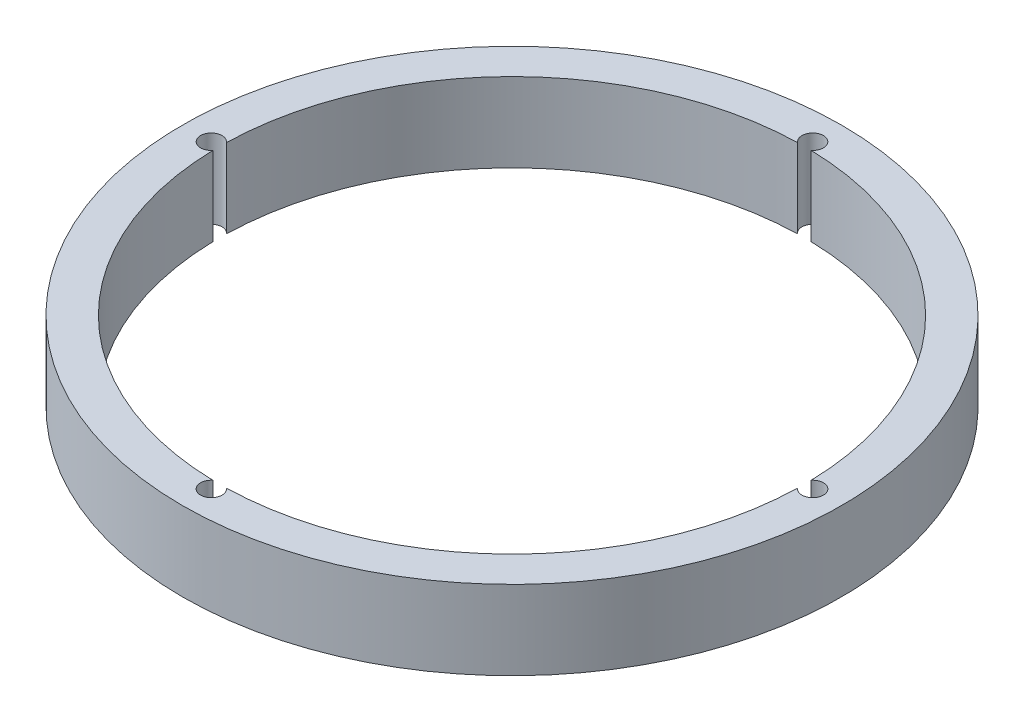
ISO-10303-21;
HEADER;
FILE_DESCRIPTION(('STEP AP214'),'2;1');
FILE_NAME('part.step','',(''),(''),'','','');
FILE_SCHEMA(('AUTOMOTIVE_DESIGN { 1 0 10303 214 1 1 1 1 }'));
ENDSEC;
DATA;
#1=APPLICATION_CONTEXT('core data for automotive mechanical design processes');
#2=APPLICATION_PROTOCOL_DEFINITION('international standard','automotive_design',2000,#1);
#3=PRODUCT_CONTEXT('',#1,'mechanical');
#4=PRODUCT('Part','Part','',(#3));
#5=PRODUCT_RELATED_PRODUCT_CATEGORY('part','',(#4));
#6=PRODUCT_DEFINITION_FORMATION('','',#4);
#7=PRODUCT_DEFINITION_CONTEXT('part definition',#1,'design');
#8=PRODUCT_DEFINITION('design','',#6,#7);
#9=PRODUCT_DEFINITION_SHAPE('','',#8);
#10=(LENGTH_UNIT() NAMED_UNIT(*) SI_UNIT(.MILLI.,.METRE.));
#11=(NAMED_UNIT(*) PLANE_ANGLE_UNIT() SI_UNIT($,.RADIAN.));
#12=(NAMED_UNIT(*) SI_UNIT($,.STERADIAN.) SOLID_ANGLE_UNIT());
#13=UNCERTAINTY_MEASURE_WITH_UNIT(LENGTH_MEASURE(1.E-05),#10,'distance_accuracy_value','');
#14=(GEOMETRIC_REPRESENTATION_CONTEXT(3) GLOBAL_UNCERTAINTY_ASSIGNED_CONTEXT((#13)) GLOBAL_UNIT_ASSIGNED_CONTEXT((#10,
#11,#12)) REPRESENTATION_CONTEXT('',''));
#15=CARTESIAN_POINT('',(0.,0.,0.));
#16=DIRECTION('',(0.,0.,1.));
#17=DIRECTION('',(1.,0.,0.));
#18=AXIS2_PLACEMENT_3D('',#15,#16,#17);
#19=CARTESIAN_POINT('',(0.,19.2,0.));
#20=DIRECTION('',(0.,1.,0.));
#21=DIRECTION('',(0.,0.,1.));
#22=AXIS2_PLACEMENT_3D('',#19,#20,#21);
#23=PLANE('',#22);
#24=CARTESIAN_POINT('',(0.,19.2,0.));
#25=DIRECTION('',(0.,1.,0.));
#26=DIRECTION('',(0.,0.,1.));
#27=AXIS2_PLACEMENT_3D('',#24,#25,#26);
#28=CIRCLE('',#27,80.);
#29=CARTESIAN_POINT('',(0.,19.2,80.));
#30=VERTEX_POINT('',#29);
#31=EDGE_CURVE('E11',#30,#30,#28,.T.);
#32=ORIENTED_EDGE('',*,*,#31,.T.);
#33=EDGE_LOOP('',(#32));
#34=FACE_BOUND('',#33,.T.);
#35=CARTESIAN_POINT('',(0.,19.2,-73.));
#36=DIRECTION('',(0.,1.,0.));
#37=DIRECTION('',(0.,0.,1.));
#38=AXIS2_PLACEMENT_3D('',#35,#36,#37);
#39=CIRCLE('',#38,2.60000000000025);
#40=CARTESIAN_POINT('',(1.63829978828229,19.2,-70.981095890411));
#41=VERTEX_POINT('',#40);
#42=CARTESIAN_POINT('',(-1.63829978828228,19.2,-70.981095890411));
#43=VERTEX_POINT('',#42);
#44=EDGE_CURVE('E118',#41,#43,#39,.T.);
#45=ORIENTED_EDGE('',*,*,#44,.F.);
#46=CARTESIAN_POINT('',(0.,19.2,0.));
#47=DIRECTION('',(0.,1.,0.));
#48=DIRECTION('',(0.,0.,1.));
#49=AXIS2_PLACEMENT_3D('',#46,#47,#48);
#50=CIRCLE('',#49,71.);
#51=CARTESIAN_POINT('',(70.981095890411,19.2,-1.638299788282));
#52=VERTEX_POINT('',#51);
#53=EDGE_CURVE('E109',#52,#41,#50,.T.);
#54=ORIENTED_EDGE('',*,*,#53,.F.);
#55=CARTESIAN_POINT('',(73.,19.2,2.54878137735549E-13));
#56=DIRECTION('',(0.,1.,0.));
#57=DIRECTION('',(0.,0.,1.));
#58=AXIS2_PLACEMENT_3D('',#55,#56,#57);
#59=CIRCLE('',#58,2.6000000000002);
#60=CARTESIAN_POINT('',(70.9810958904109,19.2,1.63829978828238));
#61=VERTEX_POINT('',#60);
#62=EDGE_CURVE('E149',#61,#52,#59,.T.);
#63=ORIENTED_EDGE('',*,*,#62,.F.);
#64=CARTESIAN_POINT('',(0.,19.2,0.));
#65=DIRECTION('',(0.,1.,0.));
#66=DIRECTION('',(0.,0.,1.));
#67=AXIS2_PLACEMENT_3D('',#64,#65,#66);
#68=CIRCLE('',#67,71.);
#69=CARTESIAN_POINT('',(1.6382997882816,19.2,70.981095890411));
#70=VERTEX_POINT('',#69);
#71=EDGE_CURVE('E146',#70,#61,#68,.T.);
#72=ORIENTED_EDGE('',*,*,#71,.F.);
#73=CARTESIAN_POINT('',(-5.09756275471097E-13,19.2,73.));
#74=DIRECTION('',(0.,1.,0.));
#75=DIRECTION('',(0.,0.,1.));
#76=AXIS2_PLACEMENT_3D('',#73,#74,#75);
#77=CIRCLE('',#76,2.60000000000019);
#78=CARTESIAN_POINT('',(-1.63829978828274,19.2,70.981095890411));
#79=VERTEX_POINT('',#78);
#80=EDGE_CURVE('E143',#79,#70,#77,.T.);
#81=ORIENTED_EDGE('',*,*,#80,.F.);
#82=CARTESIAN_POINT('',(0.,19.2,0.));
#83=DIRECTION('',(0.,1.,0.));
#84=DIRECTION('',(0.,0.,1.));
#85=AXIS2_PLACEMENT_3D('',#82,#83,#84);
#86=CIRCLE('',#85,71.);
#87=CARTESIAN_POINT('',(-70.981095890411,19.2,1.63829978828155));
#88=VERTEX_POINT('',#87);
#89=EDGE_CURVE('E140',#88,#79,#86,.T.);
#90=ORIENTED_EDGE('',*,*,#89,.F.);
#91=CARTESIAN_POINT('',(-73.,19.2,-7.64634413206646E-13));
#92=DIRECTION('',(0.,1.,0.));
#93=DIRECTION('',(0.,0.,1.));
#94=AXIS2_PLACEMENT_3D('',#91,#92,#93);
#95=CIRCLE('',#94,2.60000000000025);
#96=CARTESIAN_POINT('',(-70.9810958904109,19.2,-1.63829978828303));
#97=VERTEX_POINT('',#96);
#98=EDGE_CURVE('E135',#97,#88,#95,.T.);
#99=ORIENTED_EDGE('',*,*,#98,.F.);
#100=CARTESIAN_POINT('',(0.,19.2,0.));
#101=DIRECTION('',(0.,1.,0.));
#102=DIRECTION('',(0.,0.,1.));
#103=AXIS2_PLACEMENT_3D('',#100,#101,#102);
#104=CIRCLE('',#103,71.);
#105=EDGE_CURVE('E131',#43,#97,#104,.T.);
#106=ORIENTED_EDGE('',*,*,#105,.F.);
#107=EDGE_LOOP('',(#45,#54,#63,#72,#81,#90,#99,#106));
#108=FACE_BOUND('',#107,.T.);
#109=ADVANCED_FACE('F43',(#34,#108),#23,.T.);
#110=CARTESIAN_POINT('',(0.,0.,0.));
#111=DIRECTION('',(0.,1.,0.));
#112=DIRECTION('',(0.,0.,1.));
#113=AXIS2_PLACEMENT_3D('',#110,#111,#112);
#114=PLANE('',#113);
#115=CARTESIAN_POINT('',(0.,0.,0.));
#116=DIRECTION('',(0.,1.,0.));
#117=DIRECTION('',(0.,0.,1.));
#118=AXIS2_PLACEMENT_3D('',#115,#116,#117);
#119=CIRCLE('',#118,80.);
#120=CARTESIAN_POINT('',(0.,0.,80.));
#121=VERTEX_POINT('',#120);
#122=EDGE_CURVE('E47',#121,#121,#119,.T.);
#123=ORIENTED_EDGE('',*,*,#122,.F.);
#124=EDGE_LOOP('',(#123));
#125=FACE_BOUND('',#124,.T.);
#126=CARTESIAN_POINT('',(0.,0.,0.));
#127=DIRECTION('',(0.,1.,0.));
#128=DIRECTION('',(0.,0.,1.));
#129=AXIS2_PLACEMENT_3D('',#126,#127,#128);
#130=CIRCLE('',#129,71.);
#131=CARTESIAN_POINT('',(70.981095890411,0.,-1.638299788282));
#132=VERTEX_POINT('',#131);
#133=CARTESIAN_POINT('',(1.63829978828229,0.,-70.981095890411));
#134=VERTEX_POINT('',#133);
#135=EDGE_CURVE('E67',#132,#134,#130,.T.);
#136=ORIENTED_EDGE('',*,*,#135,.T.);
#137=CARTESIAN_POINT('',(0.,0.,-73.));
#138=DIRECTION('',(0.,1.,0.));
#139=DIRECTION('',(0.,0.,1.));
#140=AXIS2_PLACEMENT_3D('',#137,#138,#139);
#141=CIRCLE('',#140,2.60000000000025);
#142=CARTESIAN_POINT('',(-1.63829978828228,0.,-70.981095890411));
#143=VERTEX_POINT('',#142);
#144=EDGE_CURVE('E125',#134,#143,#141,.T.);
#145=ORIENTED_EDGE('',*,*,#144,.T.);
#146=CARTESIAN_POINT('',(0.,0.,0.));
#147=DIRECTION('',(0.,1.,0.));
#148=DIRECTION('',(0.,0.,1.));
#149=AXIS2_PLACEMENT_3D('',#146,#147,#148);
#150=CIRCLE('',#149,71.);
#151=CARTESIAN_POINT('',(-70.9810958904109,0.,-1.63829978828303));
#152=VERTEX_POINT('',#151);
#153=EDGE_CURVE('E156',#143,#152,#150,.T.);
#154=ORIENTED_EDGE('',*,*,#153,.T.);
#155=CARTESIAN_POINT('',(-73.,0.,-7.64634413206646E-13));
#156=DIRECTION('',(0.,1.,0.));
#157=DIRECTION('',(0.,0.,1.));
#158=AXIS2_PLACEMENT_3D('',#155,#156,#157);
#159=CIRCLE('',#158,2.60000000000025);
#160=CARTESIAN_POINT('',(-70.981095890411,0.,1.63829978828155));
#161=VERTEX_POINT('',#160);
#162=EDGE_CURVE('E160',#152,#161,#159,.T.);
#163=ORIENTED_EDGE('',*,*,#162,.T.);
#164=CARTESIAN_POINT('',(0.,0.,0.));
#165=DIRECTION('',(0.,1.,0.));
#166=DIRECTION('',(0.,0.,1.));
#167=AXIS2_PLACEMENT_3D('',#164,#165,#166);
#168=CIRCLE('',#167,71.);
#169=CARTESIAN_POINT('',(-1.63829978828274,0.,70.981095890411));
#170=VERTEX_POINT('',#169);
#171=EDGE_CURVE('E164',#161,#170,#168,.T.);
#172=ORIENTED_EDGE('',*,*,#171,.T.);
#173=CARTESIAN_POINT('',(-5.09756275471097E-13,0.,73.));
#174=DIRECTION('',(0.,1.,0.));
#175=DIRECTION('',(0.,0.,1.));
#176=AXIS2_PLACEMENT_3D('',#173,#174,#175);
#177=CIRCLE('',#176,2.60000000000019);
#178=CARTESIAN_POINT('',(1.6382997882816,0.,70.981095890411));
#179=VERTEX_POINT('',#178);
#180=EDGE_CURVE('E168',#170,#179,#177,.T.);
#181=ORIENTED_EDGE('',*,*,#180,.T.);
#182=CARTESIAN_POINT('',(0.,0.,0.));
#183=DIRECTION('',(0.,1.,0.));
#184=DIRECTION('',(0.,0.,1.));
#185=AXIS2_PLACEMENT_3D('',#182,#183,#184);
#186=CIRCLE('',#185,71.);
#187=CARTESIAN_POINT('',(70.9810958904109,0.,1.63829978828238));
#188=VERTEX_POINT('',#187);
#189=EDGE_CURVE('E172',#179,#188,#186,.T.);
#190=ORIENTED_EDGE('',*,*,#189,.T.);
#191=CARTESIAN_POINT('',(73.,0.,2.54878137735549E-13));
#192=DIRECTION('',(0.,1.,0.));
#193=DIRECTION('',(0.,0.,1.));
#194=AXIS2_PLACEMENT_3D('',#191,#192,#193);
#195=CIRCLE('',#194,2.6000000000002);
#196=EDGE_CURVE('E119',#188,#132,#195,.T.);
#197=ORIENTED_EDGE('',*,*,#196,.T.);
#198=EDGE_LOOP('',(#136,#145,#154,#163,#172,#181,#190,#197));
#199=FACE_BOUND('',#198,.T.);
#200=ADVANCED_FACE('F202',(#125,#199),#114,.F.);
#201=CARTESIAN_POINT('',(0.,19.2,0.));
#202=DIRECTION('',(0.,-1.,0.));
#203=DIRECTION('',(0.,0.,-1.));
#204=AXIS2_PLACEMENT_3D('',#201,#202,#203);
#205=CYLINDRICAL_SURFACE('',#204,80.);
#206=ORIENTED_EDGE('',*,*,#31,.F.);
#207=EDGE_LOOP('',(#206));
#208=FACE_BOUND('',#207,.T.);
#209=ORIENTED_EDGE('',*,*,#122,.T.);
#210=EDGE_LOOP('',(#209));
#211=FACE_BOUND('',#210,.T.);
#212=ADVANCED_FACE('F45',(#208,#211),#205,.T.);
#213=CARTESIAN_POINT('',(0.,19.2,0.));
#214=DIRECTION('',(0.,-1.,0.));
#215=DIRECTION('',(0.,0.,-1.));
#216=AXIS2_PLACEMENT_3D('',#213,#214,#215);
#217=CYLINDRICAL_SURFACE('',#216,71.);
#218=ORIENTED_EDGE('',*,*,#135,.F.);
#219=DIRECTION('',(0.,-1.,0.));
#220=VECTOR('',#219,1.);
#221=CARTESIAN_POINT('',(70.981095890411,19.2,-1.638299788282));
#222=LINE('',#221,#220);
#223=EDGE_CURVE('E113',#52,#132,#222,.T.);
#224=ORIENTED_EDGE('',*,*,#223,.F.);
#225=ORIENTED_EDGE('',*,*,#53,.T.);
#226=DIRECTION('',(0.,-1.,0.));
#227=VECTOR('',#226,1.);
#228=CARTESIAN_POINT('',(1.63829978828229,19.2,-70.981095890411));
#229=LINE('',#228,#227);
#230=EDGE_CURVE('E112',#41,#134,#229,.T.);
#231=ORIENTED_EDGE('',*,*,#230,.T.);
#232=EDGE_LOOP('',(#218,#224,#225,#231));
#233=FACE_BOUND('',#232,.T.);
#234=ADVANCED_FACE('F111',(#233),#217,.F.);
#235=CARTESIAN_POINT('',(0.,19.2,-73.));
#236=DIRECTION('',(0.,-1.,0.));
#237=DIRECTION('',(0.,0.,-1.));
#238=AXIS2_PLACEMENT_3D('',#235,#236,#237);
#239=CYLINDRICAL_SURFACE('',#238,2.60000000000025);
#240=ORIENTED_EDGE('',*,*,#144,.F.);
#241=ORIENTED_EDGE('',*,*,#230,.F.);
#242=ORIENTED_EDGE('',*,*,#44,.T.);
#243=DIRECTION('',(0.,-1.,0.));
#244=VECTOR('',#243,1.);
#245=CARTESIAN_POINT('',(-1.63829978828228,19.2,-70.981095890411));
#246=LINE('',#245,#244);
#247=EDGE_CURVE('E127',#43,#143,#246,.T.);
#248=ORIENTED_EDGE('',*,*,#247,.T.);
#249=EDGE_LOOP('',(#240,#241,#242,#248));
#250=FACE_BOUND('',#249,.T.);
#251=ADVANCED_FACE('F122',(#250),#239,.F.);
#252=CARTESIAN_POINT('',(0.,19.2,0.));
#253=DIRECTION('',(0.,-1.,0.));
#254=DIRECTION('',(0.,0.,-1.));
#255=AXIS2_PLACEMENT_3D('',#252,#253,#254);
#256=CYLINDRICAL_SURFACE('',#255,71.);
#257=ORIENTED_EDGE('',*,*,#153,.F.);
#258=ORIENTED_EDGE('',*,*,#247,.F.);
#259=ORIENTED_EDGE('',*,*,#105,.T.);
#260=DIRECTION('',(0.,-1.,0.));
#261=VECTOR('',#260,1.);
#262=CARTESIAN_POINT('',(-70.9810958904109,19.2,-1.63829978828303));
#263=LINE('',#262,#261);
#264=EDGE_CURVE('E192',#97,#152,#263,.T.);
#265=ORIENTED_EDGE('',*,*,#264,.T.);
#266=EDGE_LOOP('',(#257,#258,#259,#265));
#267=FACE_BOUND('',#266,.T.);
#268=ADVANCED_FACE('F198',(#267),#256,.F.);
#269=CARTESIAN_POINT('',(-73.,19.2,-7.64634413206646E-13));
#270=DIRECTION('',(0.,-1.,0.));
#271=DIRECTION('',(0.,0.,-1.));
#272=AXIS2_PLACEMENT_3D('',#269,#270,#271);
#273=CYLINDRICAL_SURFACE('',#272,2.60000000000025);
#274=ORIENTED_EDGE('',*,*,#162,.F.);
#275=ORIENTED_EDGE('',*,*,#264,.F.);
#276=ORIENTED_EDGE('',*,*,#98,.T.);
#277=DIRECTION('',(0.,-1.,0.));
#278=VECTOR('',#277,1.);
#279=CARTESIAN_POINT('',(-70.981095890411,19.2,1.63829978828155));
#280=LINE('',#279,#278);
#281=EDGE_CURVE('E189',#88,#161,#280,.T.);
#282=ORIENTED_EDGE('',*,*,#281,.T.);
#283=EDGE_LOOP('',(#274,#275,#276,#282));
#284=FACE_BOUND('',#283,.T.);
#285=ADVANCED_FACE('F220',(#284),#273,.F.);
#286=CARTESIAN_POINT('',(0.,19.2,0.));
#287=DIRECTION('',(0.,-1.,0.));
#288=DIRECTION('',(0.,0.,-1.));
#289=AXIS2_PLACEMENT_3D('',#286,#287,#288);
#290=CYLINDRICAL_SURFACE('',#289,71.);
#291=ORIENTED_EDGE('',*,*,#171,.F.);
#292=ORIENTED_EDGE('',*,*,#281,.F.);
#293=ORIENTED_EDGE('',*,*,#89,.T.);
#294=DIRECTION('',(0.,-1.,0.));
#295=VECTOR('',#294,1.);
#296=CARTESIAN_POINT('',(-1.63829978828274,19.2,70.981095890411));
#297=LINE('',#296,#295);
#298=EDGE_CURVE('E186',#79,#170,#297,.T.);
#299=ORIENTED_EDGE('',*,*,#298,.T.);
#300=EDGE_LOOP('',(#291,#292,#293,#299));
#301=FACE_BOUND('',#300,.T.);
#302=ADVANCED_FACE('F217',(#301),#290,.F.);
#303=CARTESIAN_POINT('',(-5.09756275471097E-13,19.2,73.));
#304=DIRECTION('',(0.,-1.,0.));
#305=DIRECTION('',(0.,0.,-1.));
#306=AXIS2_PLACEMENT_3D('',#303,#304,#305);
#307=CYLINDRICAL_SURFACE('',#306,2.60000000000019);
#308=ORIENTED_EDGE('',*,*,#180,.F.);
#309=ORIENTED_EDGE('',*,*,#298,.F.);
#310=ORIENTED_EDGE('',*,*,#80,.T.);
#311=DIRECTION('',(0.,-1.,0.));
#312=VECTOR('',#311,1.);
#313=CARTESIAN_POINT('',(1.6382997882816,19.2,70.981095890411));
#314=LINE('',#313,#312);
#315=EDGE_CURVE('E183',#70,#179,#314,.T.);
#316=ORIENTED_EDGE('',*,*,#315,.T.);
#317=EDGE_LOOP('',(#308,#309,#310,#316));
#318=FACE_BOUND('',#317,.T.);
#319=ADVANCED_FACE('F213',(#318),#307,.F.);
#320=CARTESIAN_POINT('',(0.,19.2,0.));
#321=DIRECTION('',(0.,-1.,0.));
#322=DIRECTION('',(0.,0.,-1.));
#323=AXIS2_PLACEMENT_3D('',#320,#321,#322);
#324=CYLINDRICAL_SURFACE('',#323,71.);
#325=ORIENTED_EDGE('',*,*,#189,.F.);
#326=ORIENTED_EDGE('',*,*,#315,.F.);
#327=ORIENTED_EDGE('',*,*,#71,.T.);
#328=DIRECTION('',(0.,-1.,0.));
#329=VECTOR('',#328,1.);
#330=CARTESIAN_POINT('',(70.9810958904109,19.2,1.63829978828238));
#331=LINE('',#330,#329);
#332=EDGE_CURVE('E59',#61,#188,#331,.T.);
#333=ORIENTED_EDGE('',*,*,#332,.T.);
#334=EDGE_LOOP('',(#325,#326,#327,#333));
#335=FACE_BOUND('',#334,.T.);
#336=ADVANCED_FACE('F210',(#335),#324,.F.);
#337=CARTESIAN_POINT('',(73.,19.2,2.54878137735549E-13));
#338=DIRECTION('',(0.,-1.,0.));
#339=DIRECTION('',(0.,0.,-1.));
#340=AXIS2_PLACEMENT_3D('',#337,#338,#339);
#341=CYLINDRICAL_SURFACE('',#340,2.6000000000002);
#342=ORIENTED_EDGE('',*,*,#196,.F.);
#343=ORIENTED_EDGE('',*,*,#332,.F.);
#344=ORIENTED_EDGE('',*,*,#62,.T.);
#345=ORIENTED_EDGE('',*,*,#223,.T.);
#346=EDGE_LOOP('',(#342,#343,#344,#345));
#347=FACE_BOUND('',#346,.T.);
#348=ADVANCED_FACE('F204',(#347),#341,.F.);
#349=CLOSED_SHELL('',(#109,#200,#212,#234,#251,#268,#285,#302,#319,#336,#348));
#350=MANIFOLD_SOLID_BREP('B2',#349);
#351=ADVANCED_BREP_SHAPE_REPRESENTATION('',(#18,#350),#14);
#352=SHAPE_DEFINITION_REPRESENTATION(#9,#351);
ENDSEC;
END-ISO-10303-21;
